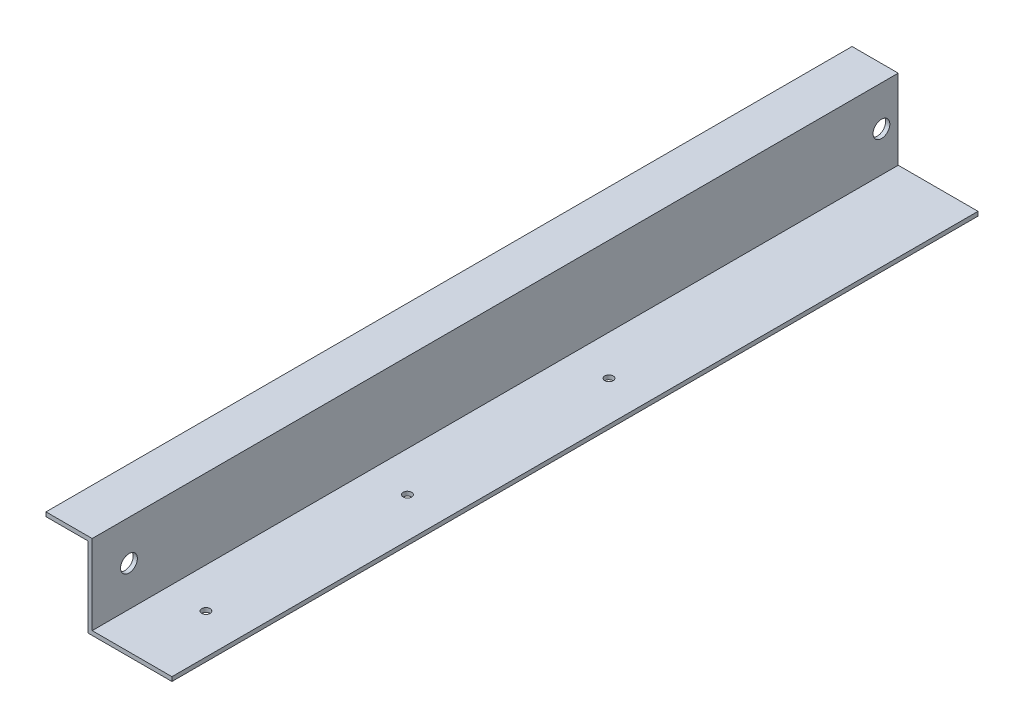
ISO-10303-21;
HEADER;
FILE_DESCRIPTION(('STEP AP214'),'2;1');
FILE_NAME('part.step','',(''),(''),'','','');
FILE_SCHEMA(('AUTOMOTIVE_DESIGN { 1 0 10303 214 1 1 1 1 }'));
ENDSEC;
DATA;
#1=APPLICATION_CONTEXT('core data for automotive mechanical design processes');
#2=APPLICATION_PROTOCOL_DEFINITION('international standard','automotive_design',2000,#1);
#3=PRODUCT_CONTEXT('',#1,'mechanical');
#4=PRODUCT('Part','Part','',(#3));
#5=PRODUCT_RELATED_PRODUCT_CATEGORY('part','',(#4));
#6=PRODUCT_DEFINITION_FORMATION('','',#4);
#7=PRODUCT_DEFINITION_CONTEXT('part definition',#1,'design');
#8=PRODUCT_DEFINITION('design','',#6,#7);
#9=PRODUCT_DEFINITION_SHAPE('','',#8);
#10=(LENGTH_UNIT() NAMED_UNIT(*) SI_UNIT(.MILLI.,.METRE.));
#11=(NAMED_UNIT(*) PLANE_ANGLE_UNIT() SI_UNIT($,.RADIAN.));
#12=(NAMED_UNIT(*) SI_UNIT($,.STERADIAN.) SOLID_ANGLE_UNIT());
#13=UNCERTAINTY_MEASURE_WITH_UNIT(LENGTH_MEASURE(1.E-05),#10,'distance_accuracy_value','');
#14=(GEOMETRIC_REPRESENTATION_CONTEXT(3) GLOBAL_UNCERTAINTY_ASSIGNED_CONTEXT((#13)) GLOBAL_UNIT_ASSIGNED_CONTEXT((#10,
#11,#12)) REPRESENTATION_CONTEXT('',''));
#15=CARTESIAN_POINT('',(0.,0.,0.));
#16=DIRECTION('',(0.,0.,1.));
#17=DIRECTION('',(1.,0.,0.));
#18=AXIS2_PLACEMENT_3D('',#15,#16,#17);
#19=CARTESIAN_POINT('',(0.79375,-14.2875,152.4));
#20=DIRECTION('',(0.,-1.,0.));
#21=DIRECTION('',(0.,0.,-1.));
#22=AXIS2_PLACEMENT_3D('',#19,#20,#21);
#23=PLANE('',#22);
#24=CARTESIAN_POINT('',(15.875,-14.2875,-27.94));
#25=DIRECTION('',(0.,1.,0.));
#26=DIRECTION('',(0.,0.,1.));
#27=AXIS2_PLACEMENT_3D('',#24,#25,#26);
#28=CIRCLE('',#27,1.5875);
#29=CARTESIAN_POINT('',(15.875,-14.2875,-26.3525));
#30=VERTEX_POINT('',#29);
#31=EDGE_CURVE('E129',#30,#30,#28,.T.);
#32=ORIENTED_EDGE('',*,*,#31,.F.);
#33=EDGE_LOOP('',(#32));
#34=FACE_BOUND('',#33,.T.);
#35=CARTESIAN_POINT('',(15.875,-14.2875,48.26));
#36=DIRECTION('',(0.,1.,0.));
#37=DIRECTION('',(0.,0.,1.));
#38=AXIS2_PLACEMENT_3D('',#35,#36,#37);
#39=CIRCLE('',#38,1.5875);
#40=CARTESIAN_POINT('',(15.875,-14.2875,49.8475));
#41=VERTEX_POINT('',#40);
#42=EDGE_CURVE('E218',#41,#41,#39,.T.);
#43=ORIENTED_EDGE('',*,*,#42,.F.);
#44=EDGE_LOOP('',(#43));
#45=FACE_BOUND('',#44,.T.);
#46=CARTESIAN_POINT('',(15.875,-14.2875,124.46));
#47=DIRECTION('',(0.,1.,0.));
#48=DIRECTION('',(0.,0.,1.));
#49=AXIS2_PLACEMENT_3D('',#46,#47,#48);
#50=CIRCLE('',#49,1.5875);
#51=CARTESIAN_POINT('',(15.875,-14.2875,126.0475));
#52=VERTEX_POINT('',#51);
#53=EDGE_CURVE('E221',#52,#52,#50,.T.);
#54=ORIENTED_EDGE('',*,*,#53,.F.);
#55=EDGE_LOOP('',(#54));
#56=FACE_BOUND('',#55,.T.);
#57=DIRECTION('',(0.,0.,-1.));
#58=VECTOR('',#57,1.);
#59=CARTESIAN_POINT('',(30.95625,-14.2875,152.4));
#60=LINE('',#59,#58);
#61=CARTESIAN_POINT('',(30.95625,-14.2875,152.4));
#62=VERTEX_POINT('',#61);
#63=CARTESIAN_POINT('',(30.95625,-14.2875,-152.4));
#64=VERTEX_POINT('',#63);
#65=EDGE_CURVE('E125',#62,#64,#60,.T.);
#66=ORIENTED_EDGE('',*,*,#65,.T.);
#67=DIRECTION('',(-1.,0.,0.));
#68=VECTOR('',#67,1.);
#69=CARTESIAN_POINT('',(0.79375,-14.2875,-152.4));
#70=LINE('',#69,#68);
#71=CARTESIAN_POINT('',(0.79375,-14.2875,-152.4));
#72=VERTEX_POINT('',#71);
#73=EDGE_CURVE('E119',#64,#72,#70,.T.);
#74=ORIENTED_EDGE('',*,*,#73,.T.);
#75=DIRECTION('',(0.,0.,-1.));
#76=VECTOR('',#75,1.);
#77=CARTESIAN_POINT('',(0.79375,-14.2875,152.4));
#78=LINE('',#77,#76);
#79=CARTESIAN_POINT('',(0.79375,-14.2875,152.4));
#80=VERTEX_POINT('',#79);
#81=EDGE_CURVE('E11',#80,#72,#78,.T.);
#82=ORIENTED_EDGE('',*,*,#81,.F.);
#83=DIRECTION('',(-1.,0.,0.));
#84=VECTOR('',#83,1.);
#85=CARTESIAN_POINT('',(0.79375,-14.2875,152.4));
#86=LINE('',#85,#84);
#87=EDGE_CURVE('E150',#62,#80,#86,.T.);
#88=ORIENTED_EDGE('',*,*,#87,.F.);
#89=EDGE_LOOP('',(#66,#74,#82,#88));
#90=FACE_BOUND('',#89,.T.);
#91=ADVANCED_FACE('F43',(#34,#45,#56,#90),#23,.F.);
#92=CARTESIAN_POINT('',(0.79375,-14.2875,152.4));
#93=DIRECTION('',(-1.,0.,0.));
#94=DIRECTION('',(0.,0.,1.));
#95=AXIS2_PLACEMENT_3D('',#92,#93,#94);
#96=PLANE('',#95);
#97=CARTESIAN_POINT('',(0.79375,0.793749999999962,138.4808));
#98=DIRECTION('',(1.,0.,0.));
#99=DIRECTION('',(0.,0.,-1.));
#100=AXIS2_PLACEMENT_3D('',#97,#98,#99);
#101=CIRCLE('',#100,3.175);
#102=CARTESIAN_POINT('',(0.79375,0.793749999999962,135.3058));
#103=VERTEX_POINT('',#102);
#104=EDGE_CURVE('E237',#103,#103,#101,.T.);
#105=ORIENTED_EDGE('',*,*,#104,.F.);
#106=EDGE_LOOP('',(#105));
#107=FACE_BOUND('',#106,.T.);
#108=CARTESIAN_POINT('',(0.79375,0.793749999999961,-146.05));
#109=DIRECTION('',(1.,0.,0.));
#110=DIRECTION('',(0.,0.,-1.));
#111=AXIS2_PLACEMENT_3D('',#108,#109,#110);
#112=CIRCLE('',#111,3.175);
#113=CARTESIAN_POINT('',(0.79375,0.793749999999961,-149.225));
#114=VERTEX_POINT('',#113);
#115=EDGE_CURVE('E234',#114,#114,#112,.T.);
#116=ORIENTED_EDGE('',*,*,#115,.F.);
#117=EDGE_LOOP('',(#116));
#118=FACE_BOUND('',#117,.T.);
#119=ORIENTED_EDGE('',*,*,#81,.T.);
#120=DIRECTION('',(0.,1.,0.));
#121=VECTOR('',#120,1.);
#122=CARTESIAN_POINT('',(0.79375,-14.2875,-152.4));
#123=LINE('',#122,#121);
#124=CARTESIAN_POINT('',(0.79375,15.875,-152.4));
#125=VERTEX_POINT('',#124);
#126=EDGE_CURVE('E109',#72,#125,#123,.T.);
#127=ORIENTED_EDGE('',*,*,#126,.T.);
#128=DIRECTION('',(0.,0.,-1.));
#129=VECTOR('',#128,1.);
#130=CARTESIAN_POINT('',(0.79375,15.875,152.4));
#131=LINE('',#130,#129);
#132=CARTESIAN_POINT('',(0.79375,15.875,152.4));
#133=VERTEX_POINT('',#132);
#134=EDGE_CURVE('E50',#133,#125,#131,.T.);
#135=ORIENTED_EDGE('',*,*,#134,.F.);
#136=DIRECTION('',(0.,1.,0.));
#137=VECTOR('',#136,1.);
#138=CARTESIAN_POINT('',(0.79375,-14.2875,152.4));
#139=LINE('',#138,#137);
#140=EDGE_CURVE('E110',#80,#133,#139,.T.);
#141=ORIENTED_EDGE('',*,*,#140,.F.);
#142=EDGE_LOOP('',(#119,#127,#135,#141));
#143=FACE_BOUND('',#142,.T.);
#144=ADVANCED_FACE('F107',(#107,#118,#143),#96,.F.);
#145=CARTESIAN_POINT('',(0.79375,15.875,152.4));
#146=DIRECTION('',(0.,-1.,0.));
#147=DIRECTION('',(0.,0.,-1.));
#148=AXIS2_PLACEMENT_3D('',#145,#146,#147);
#149=PLANE('',#148);
#150=ORIENTED_EDGE('',*,*,#134,.T.);
#151=DIRECTION('',(-1.,0.,0.));
#152=VECTOR('',#151,1.);
#153=CARTESIAN_POINT('',(0.79375,15.875,-152.4));
#154=LINE('',#153,#152);
#155=CARTESIAN_POINT('',(-16.66875,15.875,-152.4));
#156=VERTEX_POINT('',#155);
#157=EDGE_CURVE('E123',#125,#156,#154,.T.);
#158=ORIENTED_EDGE('',*,*,#157,.T.);
#159=DIRECTION('',(0.,0.,-1.));
#160=VECTOR('',#159,1.);
#161=CARTESIAN_POINT('',(-16.66875,15.875,152.4));
#162=LINE('',#161,#160);
#163=CARTESIAN_POINT('',(-16.66875,15.875,152.4));
#164=VERTEX_POINT('',#163);
#165=EDGE_CURVE('E172',#164,#156,#162,.T.);
#166=ORIENTED_EDGE('',*,*,#165,.F.);
#167=DIRECTION('',(-1.,0.,0.));
#168=VECTOR('',#167,1.);
#169=CARTESIAN_POINT('',(0.79375,15.875,152.4));
#170=LINE('',#169,#168);
#171=EDGE_CURVE('E153',#133,#164,#170,.T.);
#172=ORIENTED_EDGE('',*,*,#171,.F.);
#173=EDGE_LOOP('',(#150,#158,#166,#172));
#174=FACE_BOUND('',#173,.T.);
#175=ADVANCED_FACE('F175',(#174),#149,.F.);
#176=CARTESIAN_POINT('',(-16.66875,15.875,152.4));
#177=DIRECTION('',(1.,0.,0.));
#178=DIRECTION('',(0.,0.,-1.));
#179=AXIS2_PLACEMENT_3D('',#176,#177,#178);
#180=PLANE('',#179);
#181=ORIENTED_EDGE('',*,*,#165,.T.);
#182=DIRECTION('',(0.,-1.,0.));
#183=VECTOR('',#182,1.);
#184=CARTESIAN_POINT('',(-16.66875,15.875,-152.4));
#185=LINE('',#184,#183);
#186=CARTESIAN_POINT('',(-16.66875,14.2875,-152.4));
#187=VERTEX_POINT('',#186);
#188=EDGE_CURVE('E136',#156,#187,#185,.T.);
#189=ORIENTED_EDGE('',*,*,#188,.T.);
#190=DIRECTION('',(0.,0.,-1.));
#191=VECTOR('',#190,1.);
#192=CARTESIAN_POINT('',(-16.66875,14.2875,152.4));
#193=LINE('',#192,#191);
#194=CARTESIAN_POINT('',(-16.66875,14.2875,152.4));
#195=VERTEX_POINT('',#194);
#196=EDGE_CURVE('E170',#195,#187,#193,.T.);
#197=ORIENTED_EDGE('',*,*,#196,.F.);
#198=DIRECTION('',(0.,-1.,0.));
#199=VECTOR('',#198,1.);
#200=CARTESIAN_POINT('',(-16.66875,15.875,152.4));
#201=LINE('',#200,#199);
#202=EDGE_CURVE('E155',#164,#195,#201,.T.);
#203=ORIENTED_EDGE('',*,*,#202,.F.);
#204=EDGE_LOOP('',(#181,#189,#197,#203));
#205=FACE_BOUND('',#204,.T.);
#206=ADVANCED_FACE('F183',(#205),#180,.F.);
#207=CARTESIAN_POINT('',(-0.79375,14.2875,152.4));
#208=DIRECTION('',(0.,1.,0.));
#209=DIRECTION('',(0.,0.,1.));
#210=AXIS2_PLACEMENT_3D('',#207,#208,#209);
#211=PLANE('',#210);
#212=ORIENTED_EDGE('',*,*,#196,.T.);
#213=DIRECTION('',(1.,0.,0.));
#214=VECTOR('',#213,1.);
#215=CARTESIAN_POINT('',(-0.79375,14.2875,-152.4));
#216=LINE('',#215,#214);
#217=CARTESIAN_POINT('',(-0.79375,14.2875,-152.4));
#218=VERTEX_POINT('',#217);
#219=EDGE_CURVE('E139',#187,#218,#216,.T.);
#220=ORIENTED_EDGE('',*,*,#219,.T.);
#221=DIRECTION('',(0.,0.,-1.));
#222=VECTOR('',#221,1.);
#223=CARTESIAN_POINT('',(-0.79375,14.2875,152.4));
#224=LINE('',#223,#222);
#225=CARTESIAN_POINT('',(-0.79375,14.2875,152.4));
#226=VERTEX_POINT('',#225);
#227=EDGE_CURVE('E168',#226,#218,#224,.T.);
#228=ORIENTED_EDGE('',*,*,#227,.F.);
#229=DIRECTION('',(1.,0.,0.));
#230=VECTOR('',#229,1.);
#231=CARTESIAN_POINT('',(-0.79375,14.2875,152.4));
#232=LINE('',#231,#230);
#233=EDGE_CURVE('E157',#195,#226,#232,.T.);
#234=ORIENTED_EDGE('',*,*,#233,.F.);
#235=EDGE_LOOP('',(#212,#220,#228,#234));
#236=FACE_BOUND('',#235,.T.);
#237=ADVANCED_FACE('F186',(#236),#211,.F.);
#238=CARTESIAN_POINT('',(-0.79375,-15.875,152.4));
#239=DIRECTION('',(1.,0.,0.));
#240=DIRECTION('',(0.,0.,-1.));
#241=AXIS2_PLACEMENT_3D('',#238,#239,#240);
#242=PLANE('',#241);
#243=CARTESIAN_POINT('',(-0.79375,0.793749999999962,138.4808));
#244=DIRECTION('',(1.,0.,0.));
#245=DIRECTION('',(0.,0.,-1.));
#246=AXIS2_PLACEMENT_3D('',#243,#244,#245);
#247=CIRCLE('',#246,3.175);
#248=CARTESIAN_POINT('',(-0.79375,0.793749999999962,135.3058));
#249=VERTEX_POINT('',#248);
#250=EDGE_CURVE('E227',#249,#249,#247,.T.);
#251=ORIENTED_EDGE('',*,*,#250,.T.);
#252=EDGE_LOOP('',(#251));
#253=FACE_BOUND('',#252,.T.);
#254=CARTESIAN_POINT('',(-0.79375,0.793749999999961,-146.05));
#255=DIRECTION('',(1.,0.,0.));
#256=DIRECTION('',(0.,0.,-1.));
#257=AXIS2_PLACEMENT_3D('',#254,#255,#256);
#258=CIRCLE('',#257,3.175);
#259=CARTESIAN_POINT('',(-0.79375,0.793749999999961,-149.225));
#260=VERTEX_POINT('',#259);
#261=EDGE_CURVE('E231',#260,#260,#258,.T.);
#262=ORIENTED_EDGE('',*,*,#261,.T.);
#263=EDGE_LOOP('',(#262));
#264=FACE_BOUND('',#263,.T.);
#265=ORIENTED_EDGE('',*,*,#227,.T.);
#266=DIRECTION('',(0.,-1.,0.));
#267=VECTOR('',#266,1.);
#268=CARTESIAN_POINT('',(-0.79375,-15.875,-152.4));
#269=LINE('',#268,#267);
#270=CARTESIAN_POINT('',(-0.79375,-15.875,-152.4));
#271=VERTEX_POINT('',#270);
#272=EDGE_CURVE('E142',#218,#271,#269,.T.);
#273=ORIENTED_EDGE('',*,*,#272,.T.);
#274=DIRECTION('',(0.,0.,-1.));
#275=VECTOR('',#274,1.);
#276=CARTESIAN_POINT('',(-0.79375,-15.875,152.4));
#277=LINE('',#276,#275);
#278=CARTESIAN_POINT('',(-0.79375,-15.875,152.4));
#279=VERTEX_POINT('',#278);
#280=EDGE_CURVE('E166',#279,#271,#277,.T.);
#281=ORIENTED_EDGE('',*,*,#280,.F.);
#282=DIRECTION('',(0.,-1.,0.));
#283=VECTOR('',#282,1.);
#284=CARTESIAN_POINT('',(-0.79375,-15.875,152.4));
#285=LINE('',#284,#283);
#286=EDGE_CURVE('E159',#226,#279,#285,.T.);
#287=ORIENTED_EDGE('',*,*,#286,.F.);
#288=EDGE_LOOP('',(#265,#273,#281,#287));
#289=FACE_BOUND('',#288,.T.);
#290=ADVANCED_FACE('F191',(#253,#264,#289),#242,.F.);
#291=CARTESIAN_POINT('',(-0.79375,-15.875,152.4));
#292=DIRECTION('',(0.,1.,0.));
#293=DIRECTION('',(0.,0.,1.));
#294=AXIS2_PLACEMENT_3D('',#291,#292,#293);
#295=PLANE('',#294);
#296=CARTESIAN_POINT('',(15.875,-15.875,-27.94));
#297=DIRECTION('',(0.,1.,0.));
#298=DIRECTION('',(0.,0.,1.));
#299=AXIS2_PLACEMENT_3D('',#296,#297,#298);
#300=CIRCLE('',#299,1.5875);
#301=CARTESIAN_POINT('',(15.875,-15.875,-26.3525));
#302=VERTEX_POINT('',#301);
#303=EDGE_CURVE('E126',#302,#302,#300,.T.);
#304=ORIENTED_EDGE('',*,*,#303,.T.);
#305=EDGE_LOOP('',(#304));
#306=FACE_BOUND('',#305,.T.);
#307=CARTESIAN_POINT('',(15.875,-15.875,48.26));
#308=DIRECTION('',(0.,1.,0.));
#309=DIRECTION('',(0.,0.,1.));
#310=AXIS2_PLACEMENT_3D('',#307,#308,#309);
#311=CIRCLE('',#310,1.5875);
#312=CARTESIAN_POINT('',(15.875,-15.875,49.8475));
#313=VERTEX_POINT('',#312);
#314=EDGE_CURVE('E223',#313,#313,#311,.T.);
#315=ORIENTED_EDGE('',*,*,#314,.T.);
#316=EDGE_LOOP('',(#315));
#317=FACE_BOUND('',#316,.T.);
#318=CARTESIAN_POINT('',(15.875,-15.875,124.46));
#319=DIRECTION('',(0.,1.,0.));
#320=DIRECTION('',(0.,0.,1.));
#321=AXIS2_PLACEMENT_3D('',#318,#319,#320);
#322=CIRCLE('',#321,1.5875);
#323=CARTESIAN_POINT('',(15.875,-15.875,126.0475));
#324=VERTEX_POINT('',#323);
#325=EDGE_CURVE('E132',#324,#324,#322,.T.);
#326=ORIENTED_EDGE('',*,*,#325,.T.);
#327=EDGE_LOOP('',(#326));
#328=FACE_BOUND('',#327,.T.);
#329=ORIENTED_EDGE('',*,*,#280,.T.);
#330=DIRECTION('',(1.,0.,0.));
#331=VECTOR('',#330,1.);
#332=CARTESIAN_POINT('',(-0.79375,-15.875,-152.4));
#333=LINE('',#332,#331);
#334=CARTESIAN_POINT('',(30.95625,-15.875,-152.4));
#335=VERTEX_POINT('',#334);
#336=EDGE_CURVE('E145',#271,#335,#333,.T.);
#337=ORIENTED_EDGE('',*,*,#336,.T.);
#338=DIRECTION('',(0.,0.,-1.));
#339=VECTOR('',#338,1.);
#340=CARTESIAN_POINT('',(30.95625,-15.875,152.4));
#341=LINE('',#340,#339);
#342=CARTESIAN_POINT('',(30.95625,-15.875,152.4));
#343=VERTEX_POINT('',#342);
#344=EDGE_CURVE('E164',#343,#335,#341,.T.);
#345=ORIENTED_EDGE('',*,*,#344,.F.);
#346=DIRECTION('',(1.,0.,0.));
#347=VECTOR('',#346,1.);
#348=CARTESIAN_POINT('',(-0.79375,-15.875,152.4));
#349=LINE('',#348,#347);
#350=EDGE_CURVE('E62',#279,#343,#349,.T.);
#351=ORIENTED_EDGE('',*,*,#350,.F.);
#352=EDGE_LOOP('',(#329,#337,#345,#351));
#353=FACE_BOUND('',#352,.T.);
#354=ADVANCED_FACE('F194',(#306,#317,#328,#353),#295,.F.);
#355=CARTESIAN_POINT('',(30.95625,-14.2875,152.4));
#356=DIRECTION('',(-1.,0.,0.));
#357=DIRECTION('',(0.,0.,1.));
#358=AXIS2_PLACEMENT_3D('',#355,#356,#357);
#359=PLANE('',#358);
#360=ORIENTED_EDGE('',*,*,#344,.T.);
#361=DIRECTION('',(0.,1.,0.));
#362=VECTOR('',#361,1.);
#363=CARTESIAN_POINT('',(30.95625,-14.2875,-152.4));
#364=LINE('',#363,#362);
#365=EDGE_CURVE('E148',#335,#64,#364,.T.);
#366=ORIENTED_EDGE('',*,*,#365,.T.);
#367=ORIENTED_EDGE('',*,*,#65,.F.);
#368=DIRECTION('',(0.,1.,0.));
#369=VECTOR('',#368,1.);
#370=CARTESIAN_POINT('',(30.95625,-14.2875,152.4));
#371=LINE('',#370,#369);
#372=EDGE_CURVE('E57',#343,#62,#371,.T.);
#373=ORIENTED_EDGE('',*,*,#372,.F.);
#374=EDGE_LOOP('',(#360,#366,#367,#373));
#375=FACE_BOUND('',#374,.T.);
#376=ADVANCED_FACE('F196',(#375),#359,.F.);
#377=CARTESIAN_POINT('',(0.,0.,152.4));
#378=DIRECTION('',(0.,0.,-1.));
#379=DIRECTION('',(-1.,0.,0.));
#380=AXIS2_PLACEMENT_3D('',#377,#378,#379);
#381=PLANE('',#380);
#382=ORIENTED_EDGE('',*,*,#87,.T.);
#383=ORIENTED_EDGE('',*,*,#140,.T.);
#384=ORIENTED_EDGE('',*,*,#171,.T.);
#385=ORIENTED_EDGE('',*,*,#202,.T.);
#386=ORIENTED_EDGE('',*,*,#233,.T.);
#387=ORIENTED_EDGE('',*,*,#286,.T.);
#388=ORIENTED_EDGE('',*,*,#350,.T.);
#389=ORIENTED_EDGE('',*,*,#372,.T.);
#390=EDGE_LOOP('',(#382,#383,#384,#385,#386,#387,#388,#389));
#391=FACE_BOUND('',#390,.T.);
#392=ADVANCED_FACE('F178',(#391),#381,.F.);
#393=CARTESIAN_POINT('',(0.,0.,-152.4));
#394=DIRECTION('',(0.,0.,-1.));
#395=DIRECTION('',(-1.,0.,0.));
#396=AXIS2_PLACEMENT_3D('',#393,#394,#395);
#397=PLANE('',#396);
#398=ORIENTED_EDGE('',*,*,#73,.F.);
#399=ORIENTED_EDGE('',*,*,#365,.F.);
#400=ORIENTED_EDGE('',*,*,#336,.F.);
#401=ORIENTED_EDGE('',*,*,#272,.F.);
#402=ORIENTED_EDGE('',*,*,#219,.F.);
#403=ORIENTED_EDGE('',*,*,#188,.F.);
#404=ORIENTED_EDGE('',*,*,#157,.F.);
#405=ORIENTED_EDGE('',*,*,#126,.F.);
#406=EDGE_LOOP('',(#398,#399,#400,#401,#402,#403,#404,#405));
#407=FACE_BOUND('',#406,.T.);
#408=ADVANCED_FACE('F117',(#407),#397,.T.);
#409=CARTESIAN_POINT('',(15.875,-15.875,124.46));
#410=DIRECTION('',(0.,1.,0.));
#411=DIRECTION('',(0.,0.,1.));
#412=AXIS2_PLACEMENT_3D('',#409,#410,#411);
#413=CYLINDRICAL_SURFACE('',#412,1.5875);
#414=ORIENTED_EDGE('',*,*,#325,.F.);
#415=EDGE_LOOP('',(#414));
#416=FACE_BOUND('',#415,.T.);
#417=ORIENTED_EDGE('',*,*,#53,.T.);
#418=EDGE_LOOP('',(#417));
#419=FACE_BOUND('',#418,.T.);
#420=ADVANCED_FACE('F268',(#416,#419),#413,.F.);
#421=CARTESIAN_POINT('',(15.875,-15.875,48.26));
#422=DIRECTION('',(0.,1.,0.));
#423=DIRECTION('',(0.,0.,1.));
#424=AXIS2_PLACEMENT_3D('',#421,#422,#423);
#425=CYLINDRICAL_SURFACE('',#424,1.5875);
#426=ORIENTED_EDGE('',*,*,#314,.F.);
#427=EDGE_LOOP('',(#426));
#428=FACE_BOUND('',#427,.T.);
#429=ORIENTED_EDGE('',*,*,#42,.T.);
#430=EDGE_LOOP('',(#429));
#431=FACE_BOUND('',#430,.T.);
#432=ADVANCED_FACE('F261',(#428,#431),#425,.F.);
#433=CARTESIAN_POINT('',(15.875,-15.875,-27.94));
#434=DIRECTION('',(0.,1.,0.));
#435=DIRECTION('',(0.,0.,1.));
#436=AXIS2_PLACEMENT_3D('',#433,#434,#435);
#437=CYLINDRICAL_SURFACE('',#436,1.5875);
#438=ORIENTED_EDGE('',*,*,#303,.F.);
#439=EDGE_LOOP('',(#438));
#440=FACE_BOUND('',#439,.T.);
#441=ORIENTED_EDGE('',*,*,#31,.T.);
#442=EDGE_LOOP('',(#441));
#443=FACE_BOUND('',#442,.T.);
#444=ADVANCED_FACE('F255',(#440,#443),#437,.F.);
#445=CARTESIAN_POINT('',(-0.79375,0.793749999999961,-146.05));
#446=DIRECTION('',(1.,0.,0.));
#447=DIRECTION('',(0.,0.,-1.));
#448=AXIS2_PLACEMENT_3D('',#445,#446,#447);
#449=CYLINDRICAL_SURFACE('',#448,3.175);
#450=ORIENTED_EDGE('',*,*,#261,.F.);
#451=EDGE_LOOP('',(#450));
#452=FACE_BOUND('',#451,.T.);
#453=ORIENTED_EDGE('',*,*,#115,.T.);
#454=EDGE_LOOP('',(#453));
#455=FACE_BOUND('',#454,.T.);
#456=ADVANCED_FACE('F248',(#452,#455),#449,.F.);
#457=CARTESIAN_POINT('',(-0.79375,0.793749999999962,138.4808));
#458=DIRECTION('',(1.,0.,0.));
#459=DIRECTION('',(0.,0.,-1.));
#460=AXIS2_PLACEMENT_3D('',#457,#458,#459);
#461=CYLINDRICAL_SURFACE('',#460,3.175);
#462=ORIENTED_EDGE('',*,*,#250,.F.);
#463=EDGE_LOOP('',(#462));
#464=FACE_BOUND('',#463,.T.);
#465=ORIENTED_EDGE('',*,*,#104,.T.);
#466=EDGE_LOOP('',(#465));
#467=FACE_BOUND('',#466,.T.);
#468=ADVANCED_FACE('F245',(#464,#467),#461,.F.);
#469=CLOSED_SHELL('',(#91,#144,#175,#206,#237,#290,#354,#376,#392,#408,#420,#432,#444,#456,#468));
#470=MANIFOLD_SOLID_BREP('B2',#469);
#471=ADVANCED_BREP_SHAPE_REPRESENTATION('',(#18,#470),#14);
#472=SHAPE_DEFINITION_REPRESENTATION(#9,#471);
ENDSEC;
END-ISO-10303-21;
